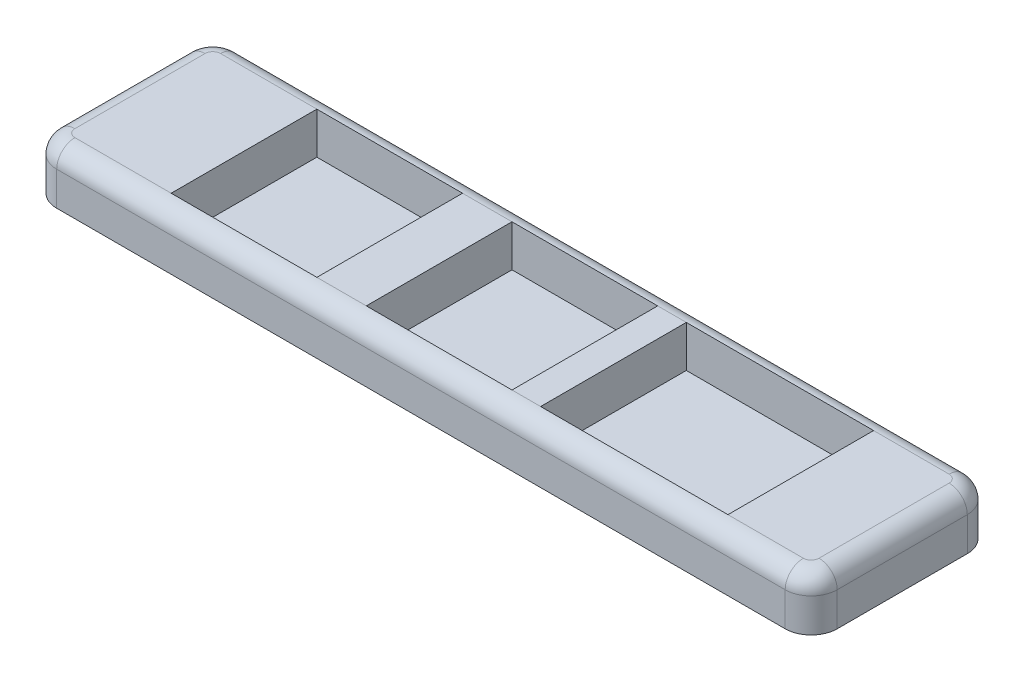
ISO-10303-21;
HEADER;
FILE_DESCRIPTION(('STEP AP214'),'2;1');
FILE_NAME('part.step','',(''),(''),'','','');
FILE_SCHEMA(('AUTOMOTIVE_DESIGN { 1 0 10303 214 1 1 1 1 }'));
ENDSEC;
DATA;
#1=APPLICATION_CONTEXT('core data for automotive mechanical design processes');
#2=APPLICATION_PROTOCOL_DEFINITION('international standard','automotive_design',2000,#1);
#3=PRODUCT_CONTEXT('',#1,'mechanical');
#4=PRODUCT('Part','Part','',(#3));
#5=PRODUCT_RELATED_PRODUCT_CATEGORY('part','',(#4));
#6=PRODUCT_DEFINITION_FORMATION('','',#4);
#7=PRODUCT_DEFINITION_CONTEXT('part definition',#1,'design');
#8=PRODUCT_DEFINITION('design','',#6,#7);
#9=PRODUCT_DEFINITION_SHAPE('','',#8);
#10=(LENGTH_UNIT() NAMED_UNIT(*) SI_UNIT(.MILLI.,.METRE.));
#11=(NAMED_UNIT(*) PLANE_ANGLE_UNIT() SI_UNIT($,.RADIAN.));
#12=(NAMED_UNIT(*) SI_UNIT($,.STERADIAN.) SOLID_ANGLE_UNIT());
#13=UNCERTAINTY_MEASURE_WITH_UNIT(LENGTH_MEASURE(1.E-05),#10,'distance_accuracy_value','');
#14=(GEOMETRIC_REPRESENTATION_CONTEXT(3) GLOBAL_UNCERTAINTY_ASSIGNED_CONTEXT((#13)) GLOBAL_UNIT_ASSIGNED_CONTEXT((#10,
#11,#12)) REPRESENTATION_CONTEXT('',''));
#15=CARTESIAN_POINT('',(0.,0.,0.));
#16=DIRECTION('',(0.,0.,1.));
#17=DIRECTION('',(1.,0.,0.));
#18=AXIS2_PLACEMENT_3D('',#15,#16,#17);
#19=CARTESIAN_POINT('',(0.,10.,0.));
#20=DIRECTION('',(0.,-1.,0.));
#21=DIRECTION('',(0.,0.,-1.));
#22=AXIS2_PLACEMENT_3D('',#19,#20,#21);
#23=PLANE('',#22);
#24=CARTESIAN_POINT('',(-70.,10.,-12.5));
#25=DIRECTION('',(0.,-1.,0.));
#26=DIRECTION('',(0.,0.,-1.));
#27=AXIS2_PLACEMENT_3D('',#24,#25,#26);
#28=CIRCLE('',#27,1.5);
#29=CARTESIAN_POINT('',(-71.5,10.,-12.5));
#30=VERTEX_POINT('',#29);
#31=CARTESIAN_POINT('',(-70.,10.,-14.));
#32=VERTEX_POINT('',#31);
#33=EDGE_CURVE('E347',#30,#32,#28,.T.);
#34=ORIENTED_EDGE('',*,*,#33,.F.);
#35=DIRECTION('',(0.,0.,1.));
#36=VECTOR('',#35,1.);
#37=CARTESIAN_POINT('',(-71.5,10.,0.));
#38=LINE('',#37,#36);
#39=CARTESIAN_POINT('',(-71.5,10.,12.5));
#40=VERTEX_POINT('',#39);
#41=EDGE_CURVE('E308',#30,#40,#38,.T.);
#42=ORIENTED_EDGE('',*,*,#41,.T.);
#43=CARTESIAN_POINT('',(-70.,10.,12.5));
#44=DIRECTION('',(0.,-1.,0.));
#45=DIRECTION('',(0.,0.,-1.));
#46=AXIS2_PLACEMENT_3D('',#43,#44,#45);
#47=CIRCLE('',#46,1.5);
#48=CARTESIAN_POINT('',(-70.,10.,14.));
#49=VERTEX_POINT('',#48);
#50=EDGE_CURVE('E344',#49,#40,#47,.T.);
#51=ORIENTED_EDGE('',*,*,#50,.F.);
#52=DIRECTION('',(1.,0.,0.));
#53=VECTOR('',#52,1.);
#54=CARTESIAN_POINT('',(0.,10.,14.));
#55=LINE('',#54,#53);
#56=CARTESIAN_POINT('',(-51.5,10.,14.));
#57=VERTEX_POINT('',#56);
#58=EDGE_CURVE('E306',#49,#57,#55,.T.);
#59=ORIENTED_EDGE('',*,*,#58,.T.);
#60=DIRECTION('',(0.,0.,1.));
#61=VECTOR('',#60,1.);
#62=CARTESIAN_POINT('',(-51.5,10.,14.));
#63=LINE('',#62,#61);
#64=CARTESIAN_POINT('',(-51.5,10.,-14.));
#65=VERTEX_POINT('',#64);
#66=EDGE_CURVE('E244',#65,#57,#63,.T.);
#67=ORIENTED_EDGE('',*,*,#66,.F.);
#68=DIRECTION('',(-1.,0.,0.));
#69=VECTOR('',#68,1.);
#70=CARTESIAN_POINT('',(0.,10.,-14.));
#71=LINE('',#70,#69);
#72=EDGE_CURVE('E311',#65,#32,#71,.T.);
#73=ORIENTED_EDGE('',*,*,#72,.T.);
#74=EDGE_LOOP('',(#34,#42,#51,#59,#67,#73));
#75=FACE_BOUND('',#74,.T.);
#76=ADVANCED_FACE('F39',(#75),#23,.F.);
#77=CARTESIAN_POINT('',(70.,10.,-12.5));
#78=DIRECTION('',(0.,-1.,0.));
#79=DIRECTION('',(0.,0.,-1.));
#80=AXIS2_PLACEMENT_3D('',#77,#78,#79);
#81=CIRCLE('',#80,1.5);
#82=CARTESIAN_POINT('',(70.,10.,-14.));
#83=VERTEX_POINT('',#82);
#84=CARTESIAN_POINT('',(71.5,10.,-12.5));
#85=VERTEX_POINT('',#84);
#86=EDGE_CURVE('E337',#83,#85,#81,.T.);
#87=ORIENTED_EDGE('',*,*,#86,.F.);
#88=DIRECTION('',(-1.,0.,0.));
#89=VECTOR('',#88,1.);
#90=CARTESIAN_POINT('',(0.,10.,-14.));
#91=LINE('',#90,#89);
#92=CARTESIAN_POINT('',(55.5,10.,-14.));
#93=VERTEX_POINT('',#92);
#94=EDGE_CURVE('E300',#83,#93,#91,.T.);
#95=ORIENTED_EDGE('',*,*,#94,.T.);
#96=DIRECTION('',(0.,0.,-1.));
#97=VECTOR('',#96,1.);
#98=CARTESIAN_POINT('',(55.5,10.,14.));
#99=LINE('',#98,#97);
#100=CARTESIAN_POINT('',(55.5,10.,14.));
#101=VERTEX_POINT('',#100);
#102=EDGE_CURVE('E415',#101,#93,#99,.T.);
#103=ORIENTED_EDGE('',*,*,#102,.F.);
#104=DIRECTION('',(1.,0.,0.));
#105=VECTOR('',#104,1.);
#106=CARTESIAN_POINT('',(0.,10.,14.));
#107=LINE('',#106,#105);
#108=CARTESIAN_POINT('',(70.,10.,14.));
#109=VERTEX_POINT('',#108);
#110=EDGE_CURVE('E294',#101,#109,#107,.T.);
#111=ORIENTED_EDGE('',*,*,#110,.T.);
#112=CARTESIAN_POINT('',(70.,10.,12.5));
#113=DIRECTION('',(0.,-1.,0.));
#114=DIRECTION('',(0.,0.,-1.));
#115=AXIS2_PLACEMENT_3D('',#112,#113,#114);
#116=CIRCLE('',#115,1.5);
#117=CARTESIAN_POINT('',(71.5,10.,12.5));
#118=VERTEX_POINT('',#117);
#119=EDGE_CURVE('E334',#118,#109,#116,.T.);
#120=ORIENTED_EDGE('',*,*,#119,.F.);
#121=DIRECTION('',(0.,0.,-1.));
#122=VECTOR('',#121,1.);
#123=CARTESIAN_POINT('',(71.5,10.,0.));
#124=LINE('',#123,#122);
#125=EDGE_CURVE('E297',#118,#85,#124,.T.);
#126=ORIENTED_EDGE('',*,*,#125,.T.);
#127=EDGE_LOOP('',(#87,#95,#103,#111,#120,#126));
#128=FACE_BOUND('',#127,.T.);
#129=ADVANCED_FACE('F412',(#128),#23,.F.);
#130=DIRECTION('',(0.,0.,1.));
#131=VECTOR('',#130,1.);
#132=CARTESIAN_POINT('',(19.5,10.,14.));
#133=LINE('',#132,#131);
#134=CARTESIAN_POINT('',(19.5,10.,-14.));
#135=VERTEX_POINT('',#134);
#136=CARTESIAN_POINT('',(19.5,10.,14.));
#137=VERTEX_POINT('',#136);
#138=EDGE_CURVE('E232',#135,#137,#133,.T.);
#139=ORIENTED_EDGE('',*,*,#138,.F.);
#140=DIRECTION('',(-1.,0.,0.));
#141=VECTOR('',#140,1.);
#142=CARTESIAN_POINT('',(0.,10.,-14.));
#143=LINE('',#142,#141);
#144=CARTESIAN_POINT('',(14.,10.,-14.));
#145=VERTEX_POINT('',#144);
#146=EDGE_CURVE('E316',#135,#145,#143,.T.);
#147=ORIENTED_EDGE('',*,*,#146,.T.);
#148=DIRECTION('',(0.,0.,-1.));
#149=VECTOR('',#148,1.);
#150=CARTESIAN_POINT('',(14.,10.,14.));
#151=LINE('',#150,#149);
#152=CARTESIAN_POINT('',(14.,10.,14.));
#153=VERTEX_POINT('',#152);
#154=EDGE_CURVE('E261',#153,#145,#151,.T.);
#155=ORIENTED_EDGE('',*,*,#154,.F.);
#156=DIRECTION('',(1.,0.,0.));
#157=VECTOR('',#156,1.);
#158=CARTESIAN_POINT('',(0.,10.,14.));
#159=LINE('',#158,#157);
#160=EDGE_CURVE('E302',#153,#137,#159,.T.);
#161=ORIENTED_EDGE('',*,*,#160,.T.);
#162=EDGE_LOOP('',(#139,#147,#155,#161));
#163=FACE_BOUND('',#162,.T.);
#164=ADVANCED_FACE('F496',(#163),#23,.F.);
#165=DIRECTION('',(0.,0.,1.));
#166=VECTOR('',#165,1.);
#167=CARTESIAN_POINT('',(-14.,10.,14.));
#168=LINE('',#167,#166);
#169=CARTESIAN_POINT('',(-14.,10.,-14.));
#170=VERTEX_POINT('',#169);
#171=CARTESIAN_POINT('',(-14.,10.,14.));
#172=VERTEX_POINT('',#171);
#173=EDGE_CURVE('E266',#170,#172,#168,.T.);
#174=ORIENTED_EDGE('',*,*,#173,.F.);
#175=DIRECTION('',(-1.,0.,0.));
#176=VECTOR('',#175,1.);
#177=CARTESIAN_POINT('',(0.,10.,-14.));
#178=LINE('',#177,#176);
#179=CARTESIAN_POINT('',(-23.5,10.,-14.));
#180=VERTEX_POINT('',#179);
#181=EDGE_CURVE('E314',#170,#180,#178,.T.);
#182=ORIENTED_EDGE('',*,*,#181,.T.);
#183=DIRECTION('',(0.,0.,-1.));
#184=VECTOR('',#183,1.);
#185=CARTESIAN_POINT('',(-23.5,10.,14.));
#186=LINE('',#185,#184);
#187=CARTESIAN_POINT('',(-23.5,10.,14.));
#188=VERTEX_POINT('',#187);
#189=EDGE_CURVE('E239',#188,#180,#186,.T.);
#190=ORIENTED_EDGE('',*,*,#189,.F.);
#191=DIRECTION('',(1.,0.,0.));
#192=VECTOR('',#191,1.);
#193=CARTESIAN_POINT('',(0.,10.,14.));
#194=LINE('',#193,#192);
#195=EDGE_CURVE('E304',#188,#172,#194,.T.);
#196=ORIENTED_EDGE('',*,*,#195,.T.);
#197=EDGE_LOOP('',(#174,#182,#190,#196));
#198=FACE_BOUND('',#197,.T.);
#199=ADVANCED_FACE('F469',(#198),#23,.F.);
#200=CARTESIAN_POINT('',(55.5,10.,14.));
#201=DIRECTION('',(-1.,0.,0.));
#202=DIRECTION('',(0.,0.,1.));
#203=AXIS2_PLACEMENT_3D('',#200,#201,#202);
#204=PLANE('',#203);
#205=DIRECTION('',(0.,-1.,0.));
#206=VECTOR('',#205,1.);
#207=CARTESIAN_POINT('',(55.5,10.,-14.));
#208=LINE('',#207,#206);
#209=CARTESIAN_POINT('',(55.5,2.,-14.));
#210=VERTEX_POINT('',#209);
#211=EDGE_CURVE('E222',#93,#210,#208,.T.);
#212=ORIENTED_EDGE('',*,*,#211,.T.);
#213=DIRECTION('',(0.,0.,1.));
#214=VECTOR('',#213,1.);
#215=CARTESIAN_POINT('',(55.5,2.,14.));
#216=LINE('',#215,#214);
#217=CARTESIAN_POINT('',(55.5,2.,14.));
#218=VERTEX_POINT('',#217);
#219=EDGE_CURVE('E204',#210,#218,#216,.T.);
#220=ORIENTED_EDGE('',*,*,#219,.T.);
#221=DIRECTION('',(0.,-1.,0.));
#222=VECTOR('',#221,1.);
#223=CARTESIAN_POINT('',(55.5,10.,14.));
#224=LINE('',#223,#222);
#225=EDGE_CURVE('E219',#101,#218,#224,.T.);
#226=ORIENTED_EDGE('',*,*,#225,.F.);
#227=ORIENTED_EDGE('',*,*,#102,.T.);
#228=EDGE_LOOP('',(#212,#220,#226,#227));
#229=FACE_BOUND('',#228,.T.);
#230=ADVANCED_FACE('F217',(#229),#204,.T.);
#231=CARTESIAN_POINT('',(19.5,10.,-14.));
#232=DIRECTION('',(0.,0.,1.));
#233=DIRECTION('',(1.,0.,0.));
#234=AXIS2_PLACEMENT_3D('',#231,#232,#233);
#235=PLANE('',#234);
#236=DIRECTION('',(0.,-1.,0.));
#237=VECTOR('',#236,1.);
#238=CARTESIAN_POINT('',(19.5,10.,-14.));
#239=LINE('',#238,#237);
#240=CARTESIAN_POINT('',(19.5,2.,-14.));
#241=VERTEX_POINT('',#240);
#242=EDGE_CURVE('E230',#135,#241,#239,.T.);
#243=ORIENTED_EDGE('',*,*,#242,.T.);
#244=DIRECTION('',(1.,0.,0.));
#245=VECTOR('',#244,1.);
#246=CARTESIAN_POINT('',(19.5,2.,-14.));
#247=LINE('',#246,#245);
#248=EDGE_CURVE('E223',#241,#210,#247,.T.);
#249=ORIENTED_EDGE('',*,*,#248,.T.);
#250=ORIENTED_EDGE('',*,*,#211,.F.);
#251=DIRECTION('',(-1.,0.,0.));
#252=VECTOR('',#251,1.);
#253=CARTESIAN_POINT('',(19.5,10.,-14.));
#254=LINE('',#253,#252);
#255=EDGE_CURVE('E489',#93,#135,#254,.T.);
#256=ORIENTED_EDGE('',*,*,#255,.T.);
#257=EDGE_LOOP('',(#243,#249,#250,#256));
#258=FACE_BOUND('',#257,.T.);
#259=ADVANCED_FACE('F501',(#258),#235,.T.);
#260=CARTESIAN_POINT('',(19.5,10.,14.));
#261=DIRECTION('',(1.,0.,0.));
#262=DIRECTION('',(0.,0.,-1.));
#263=AXIS2_PLACEMENT_3D('',#260,#261,#262);
#264=PLANE('',#263);
#265=DIRECTION('',(0.,-1.,0.));
#266=VECTOR('',#265,1.);
#267=CARTESIAN_POINT('',(19.5,10.,14.));
#268=LINE('',#267,#266);
#269=CARTESIAN_POINT('',(19.5,2.,14.));
#270=VERTEX_POINT('',#269);
#271=EDGE_CURVE('E228',#137,#270,#268,.T.);
#272=ORIENTED_EDGE('',*,*,#271,.T.);
#273=DIRECTION('',(0.,0.,-1.));
#274=VECTOR('',#273,1.);
#275=CARTESIAN_POINT('',(19.5,2.,14.));
#276=LINE('',#275,#274);
#277=EDGE_CURVE('E207',#270,#241,#276,.T.);
#278=ORIENTED_EDGE('',*,*,#277,.T.);
#279=ORIENTED_EDGE('',*,*,#242,.F.);
#280=ORIENTED_EDGE('',*,*,#138,.T.);
#281=EDGE_LOOP('',(#272,#278,#279,#280));
#282=FACE_BOUND('',#281,.T.);
#283=ADVANCED_FACE('F494',(#282),#264,.T.);
#284=CARTESIAN_POINT('',(19.5,10.,14.));
#285=DIRECTION('',(0.,0.,-1.));
#286=DIRECTION('',(-1.,0.,0.));
#287=AXIS2_PLACEMENT_3D('',#284,#285,#286);
#288=PLANE('',#287);
#289=ORIENTED_EDGE('',*,*,#225,.T.);
#290=DIRECTION('',(-1.,0.,0.));
#291=VECTOR('',#290,1.);
#292=CARTESIAN_POINT('',(19.5,2.,14.));
#293=LINE('',#292,#291);
#294=EDGE_CURVE('E201',#218,#270,#293,.T.);
#295=ORIENTED_EDGE('',*,*,#294,.T.);
#296=ORIENTED_EDGE('',*,*,#271,.F.);
#297=DIRECTION('',(1.,0.,0.));
#298=VECTOR('',#297,1.);
#299=CARTESIAN_POINT('',(19.5,10.,14.));
#300=LINE('',#299,#298);
#301=EDGE_CURVE('E227',#137,#101,#300,.T.);
#302=ORIENTED_EDGE('',*,*,#301,.T.);
#303=EDGE_LOOP('',(#289,#295,#296,#302));
#304=FACE_BOUND('',#303,.T.);
#305=ADVANCED_FACE('F225',(#304),#288,.T.);
#306=CARTESIAN_POINT('',(14.,10.,14.));
#307=DIRECTION('',(-1.,0.,0.));
#308=DIRECTION('',(0.,0.,1.));
#309=AXIS2_PLACEMENT_3D('',#306,#307,#308);
#310=PLANE('',#309);
#311=DIRECTION('',(0.,-1.,0.));
#312=VECTOR('',#311,1.);
#313=CARTESIAN_POINT('',(14.,10.,-14.));
#314=LINE('',#313,#312);
#315=CARTESIAN_POINT('',(14.,2.,-14.));
#316=VERTEX_POINT('',#315);
#317=EDGE_CURVE('E280',#145,#316,#314,.T.);
#318=ORIENTED_EDGE('',*,*,#317,.T.);
#319=DIRECTION('',(0.,0.,1.));
#320=VECTOR('',#319,1.);
#321=CARTESIAN_POINT('',(14.,2.,14.));
#322=LINE('',#321,#320);
#323=CARTESIAN_POINT('',(14.,2.,14.));
#324=VERTEX_POINT('',#323);
#325=EDGE_CURVE('E508',#316,#324,#322,.T.);
#326=ORIENTED_EDGE('',*,*,#325,.T.);
#327=DIRECTION('',(0.,-1.,0.));
#328=VECTOR('',#327,1.);
#329=CARTESIAN_POINT('',(14.,10.,14.));
#330=LINE('',#329,#328);
#331=EDGE_CURVE('E271',#153,#324,#330,.T.);
#332=ORIENTED_EDGE('',*,*,#331,.F.);
#333=ORIENTED_EDGE('',*,*,#154,.T.);
#334=EDGE_LOOP('',(#318,#326,#332,#333));
#335=FACE_BOUND('',#334,.T.);
#336=ADVANCED_FACE('F522',(#335),#310,.T.);
#337=CARTESIAN_POINT('',(-14.,10.,-14.));
#338=DIRECTION('',(0.,0.,1.));
#339=DIRECTION('',(1.,0.,0.));
#340=AXIS2_PLACEMENT_3D('',#337,#338,#339);
#341=PLANE('',#340);
#342=DIRECTION('',(0.,-1.,0.));
#343=VECTOR('',#342,1.);
#344=CARTESIAN_POINT('',(-14.,10.,-14.));
#345=LINE('',#344,#343);
#346=CARTESIAN_POINT('',(-14.,2.,-14.));
#347=VERTEX_POINT('',#346);
#348=EDGE_CURVE('E277',#170,#347,#345,.T.);
#349=ORIENTED_EDGE('',*,*,#348,.T.);
#350=DIRECTION('',(1.,0.,0.));
#351=VECTOR('',#350,1.);
#352=CARTESIAN_POINT('',(-14.,2.,-14.));
#353=LINE('',#352,#351);
#354=EDGE_CURVE('E511',#347,#316,#353,.T.);
#355=ORIENTED_EDGE('',*,*,#354,.T.);
#356=ORIENTED_EDGE('',*,*,#317,.F.);
#357=DIRECTION('',(-1.,0.,0.));
#358=VECTOR('',#357,1.);
#359=CARTESIAN_POINT('',(-14.,10.,-14.));
#360=LINE('',#359,#358);
#361=EDGE_CURVE('E264',#145,#170,#360,.T.);
#362=ORIENTED_EDGE('',*,*,#361,.T.);
#363=EDGE_LOOP('',(#349,#355,#356,#362));
#364=FACE_BOUND('',#363,.T.);
#365=ADVANCED_FACE('F519',(#364),#341,.T.);
#366=CARTESIAN_POINT('',(-14.,10.,14.));
#367=DIRECTION('',(1.,0.,0.));
#368=DIRECTION('',(0.,0.,-1.));
#369=AXIS2_PLACEMENT_3D('',#366,#367,#368);
#370=PLANE('',#369);
#371=DIRECTION('',(0.,-1.,0.));
#372=VECTOR('',#371,1.);
#373=CARTESIAN_POINT('',(-14.,10.,14.));
#374=LINE('',#373,#372);
#375=CARTESIAN_POINT('',(-14.,2.,14.));
#376=VERTEX_POINT('',#375);
#377=EDGE_CURVE('E274',#172,#376,#374,.T.);
#378=ORIENTED_EDGE('',*,*,#377,.T.);
#379=DIRECTION('',(0.,0.,-1.));
#380=VECTOR('',#379,1.);
#381=CARTESIAN_POINT('',(-14.,2.,14.));
#382=LINE('',#381,#380);
#383=EDGE_CURVE('E483',#376,#347,#382,.T.);
#384=ORIENTED_EDGE('',*,*,#383,.T.);
#385=ORIENTED_EDGE('',*,*,#348,.F.);
#386=ORIENTED_EDGE('',*,*,#173,.T.);
#387=EDGE_LOOP('',(#378,#384,#385,#386));
#388=FACE_BOUND('',#387,.T.);
#389=ADVANCED_FACE('F516',(#388),#370,.T.);
#390=CARTESIAN_POINT('',(-14.,10.,14.));
#391=DIRECTION('',(0.,0.,-1.));
#392=DIRECTION('',(-1.,0.,0.));
#393=AXIS2_PLACEMENT_3D('',#390,#391,#392);
#394=PLANE('',#393);
#395=ORIENTED_EDGE('',*,*,#331,.T.);
#396=DIRECTION('',(-1.,0.,0.));
#397=VECTOR('',#396,1.);
#398=CARTESIAN_POINT('',(-14.,2.,14.));
#399=LINE('',#398,#397);
#400=EDGE_CURVE('E503',#324,#376,#399,.T.);
#401=ORIENTED_EDGE('',*,*,#400,.T.);
#402=ORIENTED_EDGE('',*,*,#377,.F.);
#403=DIRECTION('',(1.,0.,0.));
#404=VECTOR('',#403,1.);
#405=CARTESIAN_POINT('',(-14.,10.,14.));
#406=LINE('',#405,#404);
#407=EDGE_CURVE('E269',#172,#153,#406,.T.);
#408=ORIENTED_EDGE('',*,*,#407,.T.);
#409=EDGE_LOOP('',(#395,#401,#402,#408));
#410=FACE_BOUND('',#409,.T.);
#411=ADVANCED_FACE('F525',(#410),#394,.T.);
#412=CARTESIAN_POINT('',(-23.5,10.,14.));
#413=DIRECTION('',(-1.,0.,0.));
#414=DIRECTION('',(0.,0.,1.));
#415=AXIS2_PLACEMENT_3D('',#412,#413,#414);
#416=PLANE('',#415);
#417=DIRECTION('',(0.,-1.,0.));
#418=VECTOR('',#417,1.);
#419=CARTESIAN_POINT('',(-23.5,10.,-14.));
#420=LINE('',#419,#418);
#421=CARTESIAN_POINT('',(-23.5,2.,-14.));
#422=VERTEX_POINT('',#421);
#423=EDGE_CURVE('E258',#180,#422,#420,.T.);
#424=ORIENTED_EDGE('',*,*,#423,.T.);
#425=DIRECTION('',(0.,0.,1.));
#426=VECTOR('',#425,1.);
#427=CARTESIAN_POINT('',(-23.5,2.,14.));
#428=LINE('',#427,#426);
#429=CARTESIAN_POINT('',(-23.5,2.,14.));
#430=VERTEX_POINT('',#429);
#431=EDGE_CURVE('E466',#422,#430,#428,.T.);
#432=ORIENTED_EDGE('',*,*,#431,.T.);
#433=DIRECTION('',(0.,-1.,0.));
#434=VECTOR('',#433,1.);
#435=CARTESIAN_POINT('',(-23.5,10.,14.));
#436=LINE('',#435,#434);
#437=EDGE_CURVE('E249',#188,#430,#436,.T.);
#438=ORIENTED_EDGE('',*,*,#437,.F.);
#439=ORIENTED_EDGE('',*,*,#189,.T.);
#440=EDGE_LOOP('',(#424,#432,#438,#439));
#441=FACE_BOUND('',#440,.T.);
#442=ADVANCED_FACE('F464',(#441),#416,.T.);
#443=CARTESIAN_POINT('',(-51.5,10.,-14.));
#444=DIRECTION('',(0.,0.,1.));
#445=DIRECTION('',(1.,0.,0.));
#446=AXIS2_PLACEMENT_3D('',#443,#444,#445);
#447=PLANE('',#446);
#448=DIRECTION('',(0.,-1.,0.));
#449=VECTOR('',#448,1.);
#450=CARTESIAN_POINT('',(-51.5,10.,-14.));
#451=LINE('',#450,#449);
#452=CARTESIAN_POINT('',(-51.5,2.,-14.));
#453=VERTEX_POINT('',#452);
#454=EDGE_CURVE('E255',#65,#453,#451,.T.);
#455=ORIENTED_EDGE('',*,*,#454,.T.);
#456=DIRECTION('',(1.,0.,0.));
#457=VECTOR('',#456,1.);
#458=CARTESIAN_POINT('',(-51.5,2.,-14.));
#459=LINE('',#458,#457);
#460=EDGE_CURVE('E477',#453,#422,#459,.T.);
#461=ORIENTED_EDGE('',*,*,#460,.T.);
#462=ORIENTED_EDGE('',*,*,#423,.F.);
#463=DIRECTION('',(-1.,0.,0.));
#464=VECTOR('',#463,1.);
#465=CARTESIAN_POINT('',(-51.5,10.,-14.));
#466=LINE('',#465,#464);
#467=EDGE_CURVE('E242',#180,#65,#466,.T.);
#468=ORIENTED_EDGE('',*,*,#467,.T.);
#469=EDGE_LOOP('',(#455,#461,#462,#468));
#470=FACE_BOUND('',#469,.T.);
#471=ADVANCED_FACE('F475',(#470),#447,.T.);
#472=CARTESIAN_POINT('',(-51.5,10.,14.));
#473=DIRECTION('',(1.,0.,0.));
#474=DIRECTION('',(0.,0.,-1.));
#475=AXIS2_PLACEMENT_3D('',#472,#473,#474);
#476=PLANE('',#475);
#477=DIRECTION('',(0.,-1.,0.));
#478=VECTOR('',#477,1.);
#479=CARTESIAN_POINT('',(-51.5,10.,14.));
#480=LINE('',#479,#478);
#481=CARTESIAN_POINT('',(-51.5,2.,14.));
#482=VERTEX_POINT('',#481);
#483=EDGE_CURVE('E252',#57,#482,#480,.T.);
#484=ORIENTED_EDGE('',*,*,#483,.T.);
#485=DIRECTION('',(0.,0.,-1.));
#486=VECTOR('',#485,1.);
#487=CARTESIAN_POINT('',(-51.5,2.,14.));
#488=LINE('',#487,#486);
#489=EDGE_CURVE('E479',#482,#453,#488,.T.);
#490=ORIENTED_EDGE('',*,*,#489,.T.);
#491=ORIENTED_EDGE('',*,*,#454,.F.);
#492=ORIENTED_EDGE('',*,*,#66,.T.);
#493=EDGE_LOOP('',(#484,#490,#491,#492));
#494=FACE_BOUND('',#493,.T.);
#495=ADVANCED_FACE('F453',(#494),#476,.T.);
#496=CARTESIAN_POINT('',(-51.5,10.,14.));
#497=DIRECTION('',(0.,0.,-1.));
#498=DIRECTION('',(-1.,0.,0.));
#499=AXIS2_PLACEMENT_3D('',#496,#497,#498);
#500=PLANE('',#499);
#501=ORIENTED_EDGE('',*,*,#437,.T.);
#502=DIRECTION('',(-1.,0.,0.));
#503=VECTOR('',#502,1.);
#504=CARTESIAN_POINT('',(-51.5,2.,14.));
#505=LINE('',#504,#503);
#506=EDGE_CURVE('E481',#430,#482,#505,.T.);
#507=ORIENTED_EDGE('',*,*,#506,.T.);
#508=ORIENTED_EDGE('',*,*,#483,.F.);
#509=DIRECTION('',(1.,0.,0.));
#510=VECTOR('',#509,1.);
#511=CARTESIAN_POINT('',(-51.5,10.,14.));
#512=LINE('',#511,#510);
#513=EDGE_CURVE('E247',#57,#188,#512,.T.);
#514=ORIENTED_EDGE('',*,*,#513,.T.);
#515=EDGE_LOOP('',(#501,#507,#508,#514));
#516=FACE_BOUND('',#515,.T.);
#517=ADVANCED_FACE('F459',(#516),#500,.T.);
#518=CARTESIAN_POINT('',(0.,0.,0.));
#519=DIRECTION('',(0.,-1.,0.));
#520=DIRECTION('',(0.,0.,-1.));
#521=AXIS2_PLACEMENT_3D('',#518,#519,#520);
#522=PLANE('',#521);
#523=DIRECTION('',(0.,0.,-1.));
#524=VECTOR('',#523,1.);
#525=CARTESIAN_POINT('',(75.,0.,17.5));
#526=LINE('',#525,#524);
#527=CARTESIAN_POINT('',(75.,0.,12.5));
#528=VERTEX_POINT('',#527);
#529=CARTESIAN_POINT('',(75.,0.,-12.5));
#530=VERTEX_POINT('',#529);
#531=EDGE_CURVE('E283',#528,#530,#526,.T.);
#532=ORIENTED_EDGE('',*,*,#531,.F.);
#533=CARTESIAN_POINT('',(70.,0.,12.5));
#534=DIRECTION('',(0.,-1.,0.));
#535=DIRECTION('',(0.,0.,-1.));
#536=AXIS2_PLACEMENT_3D('',#533,#534,#535);
#537=CIRCLE('',#536,5.);
#538=CARTESIAN_POINT('',(70.,0.,17.5));
#539=VERTEX_POINT('',#538);
#540=EDGE_CURVE('E366',#528,#539,#537,.T.);
#541=ORIENTED_EDGE('',*,*,#540,.T.);
#542=DIRECTION('',(1.,0.,0.));
#543=VECTOR('',#542,1.);
#544=CARTESIAN_POINT('',(-75.,0.,17.5));
#545=LINE('',#544,#543);
#546=CARTESIAN_POINT('',(-70.,0.,17.5));
#547=VERTEX_POINT('',#546);
#548=EDGE_CURVE('E291',#547,#539,#545,.T.);
#549=ORIENTED_EDGE('',*,*,#548,.F.);
#550=CARTESIAN_POINT('',(-70.,0.,12.5));
#551=DIRECTION('',(0.,-1.,0.));
#552=DIRECTION('',(0.,0.,-1.));
#553=AXIS2_PLACEMENT_3D('',#550,#551,#552);
#554=CIRCLE('',#553,5.);
#555=CARTESIAN_POINT('',(-75.,0.,12.5));
#556=VERTEX_POINT('',#555);
#557=EDGE_CURVE('E364',#547,#556,#554,.T.);
#558=ORIENTED_EDGE('',*,*,#557,.T.);
#559=DIRECTION('',(0.,0.,1.));
#560=VECTOR('',#559,1.);
#561=CARTESIAN_POINT('',(-75.,0.,17.5));
#562=LINE('',#561,#560);
#563=CARTESIAN_POINT('',(-75.,0.,-12.5));
#564=VERTEX_POINT('',#563);
#565=EDGE_CURVE('E288',#564,#556,#562,.T.);
#566=ORIENTED_EDGE('',*,*,#565,.F.);
#567=CARTESIAN_POINT('',(-70.,0.,-12.5));
#568=DIRECTION('',(0.,-1.,0.));
#569=DIRECTION('',(0.,0.,-1.));
#570=AXIS2_PLACEMENT_3D('',#567,#568,#569);
#571=CIRCLE('',#570,5.);
#572=CARTESIAN_POINT('',(-70.,0.,-17.5));
#573=VERTEX_POINT('',#572);
#574=EDGE_CURVE('E56',#564,#573,#571,.T.);
#575=ORIENTED_EDGE('',*,*,#574,.T.);
#576=DIRECTION('',(-1.,0.,0.));
#577=VECTOR('',#576,1.);
#578=CARTESIAN_POINT('',(-75.,0.,-17.5));
#579=LINE('',#578,#577);
#580=CARTESIAN_POINT('',(70.,0.,-17.5));
#581=VERTEX_POINT('',#580);
#582=EDGE_CURVE('E286',#581,#573,#579,.T.);
#583=ORIENTED_EDGE('',*,*,#582,.F.);
#584=CARTESIAN_POINT('',(70.,0.,-12.5));
#585=DIRECTION('',(0.,-1.,0.));
#586=DIRECTION('',(0.,0.,-1.));
#587=AXIS2_PLACEMENT_3D('',#584,#585,#586);
#588=CIRCLE('',#587,5.);
#589=EDGE_CURVE('E361',#581,#530,#588,.T.);
#590=ORIENTED_EDGE('',*,*,#589,.T.);
#591=EDGE_LOOP('',(#532,#541,#549,#558,#566,#575,#583,#590));
#592=FACE_BOUND('',#591,.T.);
#593=ADVANCED_FACE('F401',(#592),#522,.T.);
#594=CARTESIAN_POINT('',(75.,10.,17.5));
#595=DIRECTION('',(-1.,0.,0.));
#596=DIRECTION('',(0.,0.,1.));
#597=AXIS2_PLACEMENT_3D('',#594,#595,#596);
#598=PLANE('',#597);
#599=DIRECTION('',(0.,0.,-1.));
#600=VECTOR('',#599,1.);
#601=CARTESIAN_POINT('',(75.,6.5,17.5));
#602=LINE('',#601,#600);
#603=CARTESIAN_POINT('',(75.,6.5,-12.5));
#604=VERTEX_POINT('',#603);
#605=CARTESIAN_POINT('',(75.,6.5,12.5));
#606=VERTEX_POINT('',#605);
#607=EDGE_CURVE('E323',#604,#606,#602,.F.);
#608=ORIENTED_EDGE('',*,*,#607,.T.);
#609=DIRECTION('',(0.,-1.,0.));
#610=VECTOR('',#609,1.);
#611=CARTESIAN_POINT('',(75.,10.,12.5));
#612=LINE('',#611,#610);
#613=EDGE_CURVE('E359',#606,#528,#612,.T.);
#614=ORIENTED_EDGE('',*,*,#613,.T.);
#615=ORIENTED_EDGE('',*,*,#531,.T.);
#616=DIRECTION('',(0.,-1.,0.));
#617=VECTOR('',#616,1.);
#618=CARTESIAN_POINT('',(75.,10.,-12.5));
#619=LINE('',#618,#617);
#620=EDGE_CURVE('E357',#530,#604,#619,.F.);
#621=ORIENTED_EDGE('',*,*,#620,.T.);
#622=EDGE_LOOP('',(#608,#614,#615,#621));
#623=FACE_BOUND('',#622,.T.);
#624=ADVANCED_FACE('F398',(#623),#598,.F.);
#625=CARTESIAN_POINT('',(-75.,10.,-17.5));
#626=DIRECTION('',(0.,0.,1.));
#627=DIRECTION('',(1.,0.,0.));
#628=AXIS2_PLACEMENT_3D('',#625,#626,#627);
#629=PLANE('',#628);
#630=ORIENTED_EDGE('',*,*,#582,.T.);
#631=DIRECTION('',(0.,-1.,0.));
#632=VECTOR('',#631,1.);
#633=CARTESIAN_POINT('',(-70.,10.,-17.5));
#634=LINE('',#633,#632);
#635=CARTESIAN_POINT('',(-70.,6.5,-17.5));
#636=VERTEX_POINT('',#635);
#637=EDGE_CURVE('E11',#573,#636,#634,.F.);
#638=ORIENTED_EDGE('',*,*,#637,.T.);
#639=DIRECTION('',(-1.,0.,0.));
#640=VECTOR('',#639,1.);
#641=CARTESIAN_POINT('',(-75.,6.5,-17.5));
#642=LINE('',#641,#640);
#643=CARTESIAN_POINT('',(70.,6.5,-17.5));
#644=VERTEX_POINT('',#643);
#645=EDGE_CURVE('E321',#636,#644,#642,.F.);
#646=ORIENTED_EDGE('',*,*,#645,.T.);
#647=DIRECTION('',(0.,-1.,0.));
#648=VECTOR('',#647,1.);
#649=CARTESIAN_POINT('',(70.,10.,-17.5));
#650=LINE('',#649,#648);
#651=EDGE_CURVE('E48',#644,#581,#650,.T.);
#652=ORIENTED_EDGE('',*,*,#651,.T.);
#653=EDGE_LOOP('',(#630,#638,#646,#652));
#654=FACE_BOUND('',#653,.T.);
#655=ADVANCED_FACE('F673',(#654),#629,.F.);
#656=CARTESIAN_POINT('',(-75.,10.,17.5));
#657=DIRECTION('',(1.,0.,0.));
#658=DIRECTION('',(0.,0.,-1.));
#659=AXIS2_PLACEMENT_3D('',#656,#657,#658);
#660=PLANE('',#659);
#661=ORIENTED_EDGE('',*,*,#565,.T.);
#662=DIRECTION('',(0.,-1.,0.));
#663=VECTOR('',#662,1.);
#664=CARTESIAN_POINT('',(-75.,10.,12.5));
#665=LINE('',#664,#663);
#666=CARTESIAN_POINT('',(-75.,6.5,12.5));
#667=VERTEX_POINT('',#666);
#668=EDGE_CURVE('E374',#556,#667,#665,.F.);
#669=ORIENTED_EDGE('',*,*,#668,.T.);
#670=DIRECTION('',(0.,0.,1.));
#671=VECTOR('',#670,1.);
#672=CARTESIAN_POINT('',(-75.,6.5,17.5));
#673=LINE('',#672,#671);
#674=CARTESIAN_POINT('',(-75.,6.5,-12.5));
#675=VERTEX_POINT('',#674);
#676=EDGE_CURVE('E318',#667,#675,#673,.F.);
#677=ORIENTED_EDGE('',*,*,#676,.T.);
#678=DIRECTION('',(0.,-1.,0.));
#679=VECTOR('',#678,1.);
#680=CARTESIAN_POINT('',(-75.,10.,-12.5));
#681=LINE('',#680,#679);
#682=EDGE_CURVE('E372',#675,#564,#681,.T.);
#683=ORIENTED_EDGE('',*,*,#682,.T.);
#684=EDGE_LOOP('',(#661,#669,#677,#683));
#685=FACE_BOUND('',#684,.T.);
#686=ADVANCED_FACE('F429',(#685),#660,.F.);
#687=CARTESIAN_POINT('',(-75.,10.,17.5));
#688=DIRECTION('',(0.,0.,-1.));
#689=DIRECTION('',(-1.,0.,0.));
#690=AXIS2_PLACEMENT_3D('',#687,#688,#689);
#691=PLANE('',#690);
#692=ORIENTED_EDGE('',*,*,#548,.T.);
#693=DIRECTION('',(0.,-1.,0.));
#694=VECTOR('',#693,1.);
#695=CARTESIAN_POINT('',(70.,10.,17.5));
#696=LINE('',#695,#694);
#697=CARTESIAN_POINT('',(70.,6.5,17.5));
#698=VERTEX_POINT('',#697);
#699=EDGE_CURVE('E370',#539,#698,#696,.F.);
#700=ORIENTED_EDGE('',*,*,#699,.T.);
#701=DIRECTION('',(1.,0.,0.));
#702=VECTOR('',#701,1.);
#703=CARTESIAN_POINT('',(-75.,6.5,17.5));
#704=LINE('',#703,#702);
#705=CARTESIAN_POINT('',(-70.,6.5,17.5));
#706=VERTEX_POINT('',#705);
#707=EDGE_CURVE('E326',#698,#706,#704,.F.);
#708=ORIENTED_EDGE('',*,*,#707,.T.);
#709=DIRECTION('',(0.,-1.,0.));
#710=VECTOR('',#709,1.);
#711=CARTESIAN_POINT('',(-70.,10.,17.5));
#712=LINE('',#711,#710);
#713=EDGE_CURVE('E368',#706,#547,#712,.T.);
#714=ORIENTED_EDGE('',*,*,#713,.T.);
#715=EDGE_LOOP('',(#692,#700,#708,#714));
#716=FACE_BOUND('',#715,.T.);
#717=ADVANCED_FACE('F423',(#716),#691,.F.);
#718=CARTESIAN_POINT('',(0.,2.,0.));
#719=DIRECTION('',(0.,-1.,0.));
#720=DIRECTION('',(0.,0.,-1.));
#721=AXIS2_PLACEMENT_3D('',#718,#719,#720);
#722=PLANE('',#721);
#723=ORIENTED_EDGE('',*,*,#489,.F.);
#724=ORIENTED_EDGE('',*,*,#506,.F.);
#725=ORIENTED_EDGE('',*,*,#431,.F.);
#726=ORIENTED_EDGE('',*,*,#460,.F.);
#727=EDGE_LOOP('',(#723,#724,#725,#726));
#728=FACE_BOUND('',#727,.T.);
#729=ADVANCED_FACE('F528',(#728),#722,.F.);
#730=CARTESIAN_POINT('',(0.,2.,0.));
#731=DIRECTION('',(0.,-1.,0.));
#732=DIRECTION('',(0.,0.,-1.));
#733=AXIS2_PLACEMENT_3D('',#730,#731,#732);
#734=PLANE('',#733);
#735=ORIENTED_EDGE('',*,*,#383,.F.);
#736=ORIENTED_EDGE('',*,*,#400,.F.);
#737=ORIENTED_EDGE('',*,*,#325,.F.);
#738=ORIENTED_EDGE('',*,*,#354,.F.);
#739=EDGE_LOOP('',(#735,#736,#737,#738));
#740=FACE_BOUND('',#739,.T.);
#741=ADVANCED_FACE('F526',(#740),#734,.F.);
#742=CARTESIAN_POINT('',(0.,2.,0.));
#743=DIRECTION('',(0.,-1.,0.));
#744=DIRECTION('',(0.,0.,-1.));
#745=AXIS2_PLACEMENT_3D('',#742,#743,#744);
#746=PLANE('',#745);
#747=ORIENTED_EDGE('',*,*,#277,.F.);
#748=ORIENTED_EDGE('',*,*,#294,.F.);
#749=ORIENTED_EDGE('',*,*,#219,.F.);
#750=ORIENTED_EDGE('',*,*,#248,.F.);
#751=EDGE_LOOP('',(#747,#748,#749,#750));
#752=FACE_BOUND('',#751,.T.);
#753=ADVANCED_FACE('F203',(#752),#746,.F.);
#754=CARTESIAN_POINT('',(71.5,6.5,0.));
#755=DIRECTION('',(0.,0.,-1.));
#756=DIRECTION('',(-1.,0.,0.));
#757=AXIS2_PLACEMENT_3D('',#754,#755,#756);
#758=CYLINDRICAL_SURFACE('',#757,3.5);
#759=ORIENTED_EDGE('',*,*,#607,.F.);
#760=CARTESIAN_POINT('',(71.5,6.5,-12.5));
#761=DIRECTION('',(0.,0.,1.));
#762=DIRECTION('',(1.,0.,0.));
#763=AXIS2_PLACEMENT_3D('',#760,#761,#762);
#764=CIRCLE('',#763,3.5);
#765=EDGE_CURVE('E331',#604,#85,#764,.T.);
#766=ORIENTED_EDGE('',*,*,#765,.T.);
#767=ORIENTED_EDGE('',*,*,#125,.F.);
#768=CARTESIAN_POINT('',(71.5,6.5,12.5));
#769=DIRECTION('',(0.,0.,-1.));
#770=DIRECTION('',(-1.,0.,0.));
#771=AXIS2_PLACEMENT_3D('',#768,#769,#770);
#772=CIRCLE('',#771,3.5);
#773=EDGE_CURVE('E329',#118,#606,#772,.T.);
#774=ORIENTED_EDGE('',*,*,#773,.T.);
#775=EDGE_LOOP('',(#759,#766,#767,#774));
#776=FACE_BOUND('',#775,.T.);
#777=ADVANCED_FACE('F409',(#776),#758,.T.);
#778=CARTESIAN_POINT('',(0.,6.5,-14.));
#779=DIRECTION('',(-1.,0.,0.));
#780=DIRECTION('',(0.,0.,1.));
#781=AXIS2_PLACEMENT_3D('',#778,#779,#780);
#782=CYLINDRICAL_SURFACE('',#781,3.5);
#783=ORIENTED_EDGE('',*,*,#645,.F.);
#784=CARTESIAN_POINT('',(-70.,6.5,-14.));
#785=DIRECTION('',(1.,0.,0.));
#786=DIRECTION('',(0.,0.,-1.));
#787=AXIS2_PLACEMENT_3D('',#784,#785,#786);
#788=CIRCLE('',#787,3.5);
#789=EDGE_CURVE('E341',#636,#32,#788,.T.);
#790=ORIENTED_EDGE('',*,*,#789,.T.);
#791=ORIENTED_EDGE('',*,*,#72,.F.);
#792=ORIENTED_EDGE('',*,*,#467,.F.);
#793=ORIENTED_EDGE('',*,*,#181,.F.);
#794=ORIENTED_EDGE('',*,*,#361,.F.);
#795=ORIENTED_EDGE('',*,*,#146,.F.);
#796=ORIENTED_EDGE('',*,*,#255,.F.);
#797=ORIENTED_EDGE('',*,*,#94,.F.);
#798=CARTESIAN_POINT('',(70.,6.5,-14.));
#799=DIRECTION('',(-1.,0.,0.));
#800=DIRECTION('',(0.,0.,1.));
#801=AXIS2_PLACEMENT_3D('',#798,#799,#800);
#802=CIRCLE('',#801,3.5);
#803=EDGE_CURVE('E339',#83,#644,#802,.T.);
#804=ORIENTED_EDGE('',*,*,#803,.T.);
#805=EDGE_LOOP('',(#783,#790,#791,#792,#793,#794,#795,#796,#797,#804));
#806=FACE_BOUND('',#805,.T.);
#807=ADVANCED_FACE('F443',(#806),#782,.T.);
#808=CARTESIAN_POINT('',(0.,6.5,14.));
#809=DIRECTION('',(1.,0.,0.));
#810=DIRECTION('',(0.,0.,-1.));
#811=AXIS2_PLACEMENT_3D('',#808,#809,#810);
#812=CYLINDRICAL_SURFACE('',#811,3.5);
#813=ORIENTED_EDGE('',*,*,#707,.F.);
#814=CARTESIAN_POINT('',(70.,6.5,14.));
#815=DIRECTION('',(-1.,0.,0.));
#816=DIRECTION('',(0.,0.,1.));
#817=AXIS2_PLACEMENT_3D('',#814,#815,#816);
#818=CIRCLE('',#817,3.5);
#819=EDGE_CURVE('E355',#698,#109,#818,.T.);
#820=ORIENTED_EDGE('',*,*,#819,.T.);
#821=ORIENTED_EDGE('',*,*,#110,.F.);
#822=ORIENTED_EDGE('',*,*,#301,.F.);
#823=ORIENTED_EDGE('',*,*,#160,.F.);
#824=ORIENTED_EDGE('',*,*,#407,.F.);
#825=ORIENTED_EDGE('',*,*,#195,.F.);
#826=ORIENTED_EDGE('',*,*,#513,.F.);
#827=ORIENTED_EDGE('',*,*,#58,.F.);
#828=CARTESIAN_POINT('',(-70.,6.5,14.));
#829=DIRECTION('',(1.,0.,0.));
#830=DIRECTION('',(0.,0.,-1.));
#831=AXIS2_PLACEMENT_3D('',#828,#829,#830);
#832=CIRCLE('',#831,3.5);
#833=EDGE_CURVE('E353',#49,#706,#832,.T.);
#834=ORIENTED_EDGE('',*,*,#833,.T.);
#835=EDGE_LOOP('',(#813,#820,#821,#822,#823,#824,#825,#826,#827,#834));
#836=FACE_BOUND('',#835,.T.);
#837=ADVANCED_FACE('F418',(#836),#812,.T.);
#838=CARTESIAN_POINT('',(-71.5,6.5,0.));
#839=DIRECTION('',(0.,0.,1.));
#840=DIRECTION('',(1.,0.,0.));
#841=AXIS2_PLACEMENT_3D('',#838,#839,#840);
#842=CYLINDRICAL_SURFACE('',#841,3.5);
#843=ORIENTED_EDGE('',*,*,#676,.F.);
#844=CARTESIAN_POINT('',(-71.5,6.5,12.5));
#845=DIRECTION('',(0.,0.,-1.));
#846=DIRECTION('',(-1.,0.,0.));
#847=AXIS2_PLACEMENT_3D('',#844,#845,#846);
#848=CIRCLE('',#847,3.5);
#849=EDGE_CURVE('E351',#667,#40,#848,.T.);
#850=ORIENTED_EDGE('',*,*,#849,.T.);
#851=ORIENTED_EDGE('',*,*,#41,.F.);
#852=CARTESIAN_POINT('',(-71.5,6.5,-12.5));
#853=DIRECTION('',(0.,0.,1.));
#854=DIRECTION('',(1.,0.,0.));
#855=AXIS2_PLACEMENT_3D('',#852,#853,#854);
#856=CIRCLE('',#855,3.5);
#857=EDGE_CURVE('E349',#30,#675,#856,.T.);
#858=ORIENTED_EDGE('',*,*,#857,.T.);
#859=EDGE_LOOP('',(#843,#850,#851,#858));
#860=FACE_BOUND('',#859,.T.);
#861=ADVANCED_FACE('F738',(#860),#842,.T.);
#862=CARTESIAN_POINT('',(70.,10.,-12.5));
#863=DIRECTION('',(0.,-1.,0.));
#864=DIRECTION('',(0.,0.,-1.));
#865=AXIS2_PLACEMENT_3D('',#862,#863,#864);
#866=CYLINDRICAL_SURFACE('',#865,5.);
#867=ORIENTED_EDGE('',*,*,#589,.F.);
#868=ORIENTED_EDGE('',*,*,#651,.F.);
#869=CARTESIAN_POINT('',(70.,6.5,-12.5));
#870=DIRECTION('',(0.,-1.,0.));
#871=DIRECTION('',(0.,0.,-1.));
#872=AXIS2_PLACEMENT_3D('',#869,#870,#871);
#873=CIRCLE('',#872,5.);
#874=EDGE_CURVE('E212',#604,#644,#873,.F.);
#875=ORIENTED_EDGE('',*,*,#874,.F.);
#876=ORIENTED_EDGE('',*,*,#620,.F.);
#877=EDGE_LOOP('',(#867,#868,#875,#876));
#878=FACE_BOUND('',#877,.T.);
#879=ADVANCED_FACE('F405',(#878),#866,.T.);
#880=CARTESIAN_POINT('',(70.,6.5,-12.5));
#881=DIRECTION('',(0.,-1.,0.));
#882=DIRECTION('',(0.,0.,-1.));
#883=AXIS2_PLACEMENT_3D('',#880,#881,#882);
#884=DEGENERATE_TOROIDAL_SURFACE('',#883,1.5,3.5,.T.);
#885=ORIENTED_EDGE('',*,*,#765,.F.);
#886=ORIENTED_EDGE('',*,*,#874,.T.);
#887=ORIENTED_EDGE('',*,*,#803,.F.);
#888=ORIENTED_EDGE('',*,*,#86,.T.);
#889=EDGE_LOOP('',(#885,#886,#887,#888));
#890=FACE_BOUND('',#889,.T.);
#891=ADVANCED_FACE('F754',(#890),#884,.T.);
#892=CARTESIAN_POINT('',(-70.,10.,-12.5));
#893=DIRECTION('',(0.,-1.,0.));
#894=DIRECTION('',(0.,0.,-1.));
#895=AXIS2_PLACEMENT_3D('',#892,#893,#894);
#896=CYLINDRICAL_SURFACE('',#895,5.);
#897=ORIENTED_EDGE('',*,*,#574,.F.);
#898=ORIENTED_EDGE('',*,*,#682,.F.);
#899=CARTESIAN_POINT('',(-70.,6.5,-12.5));
#900=DIRECTION('',(0.,-1.,0.));
#901=DIRECTION('',(0.,0.,-1.));
#902=AXIS2_PLACEMENT_3D('',#899,#900,#901);
#903=CIRCLE('',#902,5.);
#904=EDGE_CURVE('E379',#636,#675,#903,.F.);
#905=ORIENTED_EDGE('',*,*,#904,.F.);
#906=ORIENTED_EDGE('',*,*,#637,.F.);
#907=EDGE_LOOP('',(#897,#898,#905,#906));
#908=FACE_BOUND('',#907,.T.);
#909=ADVANCED_FACE('F434',(#908),#896,.T.);
#910=CARTESIAN_POINT('',(-70.,6.5,-12.5));
#911=DIRECTION('',(0.,-1.,0.));
#912=DIRECTION('',(0.,0.,-1.));
#913=AXIS2_PLACEMENT_3D('',#910,#911,#912);
#914=DEGENERATE_TOROIDAL_SURFACE('',#913,1.5,3.5,.T.);
#915=ORIENTED_EDGE('',*,*,#789,.F.);
#916=ORIENTED_EDGE('',*,*,#904,.T.);
#917=ORIENTED_EDGE('',*,*,#857,.F.);
#918=ORIENTED_EDGE('',*,*,#33,.T.);
#919=EDGE_LOOP('',(#915,#916,#917,#918));
#920=FACE_BOUND('',#919,.T.);
#921=ADVANCED_FACE('F439',(#920),#914,.T.);
#922=CARTESIAN_POINT('',(-70.,10.,12.5));
#923=DIRECTION('',(0.,-1.,0.));
#924=DIRECTION('',(0.,0.,-1.));
#925=AXIS2_PLACEMENT_3D('',#922,#923,#924);
#926=CYLINDRICAL_SURFACE('',#925,5.);
#927=ORIENTED_EDGE('',*,*,#557,.F.);
#928=ORIENTED_EDGE('',*,*,#713,.F.);
#929=CARTESIAN_POINT('',(-70.,6.5,12.5));
#930=DIRECTION('',(0.,-1.,0.));
#931=DIRECTION('',(0.,0.,-1.));
#932=AXIS2_PLACEMENT_3D('',#929,#930,#931);
#933=CIRCLE('',#932,5.);
#934=EDGE_CURVE('E381',#667,#706,#933,.F.);
#935=ORIENTED_EDGE('',*,*,#934,.F.);
#936=ORIENTED_EDGE('',*,*,#668,.F.);
#937=EDGE_LOOP('',(#927,#928,#935,#936));
#938=FACE_BOUND('',#937,.T.);
#939=ADVANCED_FACE('F426',(#938),#926,.T.);
#940=CARTESIAN_POINT('',(-70.,6.5,12.5));
#941=DIRECTION('',(0.,-1.,0.));
#942=DIRECTION('',(0.,0.,-1.));
#943=AXIS2_PLACEMENT_3D('',#940,#941,#942);
#944=DEGENERATE_TOROIDAL_SURFACE('',#943,1.5,3.5,.T.);
#945=ORIENTED_EDGE('',*,*,#833,.F.);
#946=ORIENTED_EDGE('',*,*,#50,.T.);
#947=ORIENTED_EDGE('',*,*,#849,.F.);
#948=ORIENTED_EDGE('',*,*,#934,.T.);
#949=EDGE_LOOP('',(#945,#946,#947,#948));
#950=FACE_BOUND('',#949,.T.);
#951=ADVANCED_FACE('F793',(#950),#944,.T.);
#952=CARTESIAN_POINT('',(70.,10.,12.5));
#953=DIRECTION('',(0.,-1.,0.));
#954=DIRECTION('',(0.,0.,-1.));
#955=AXIS2_PLACEMENT_3D('',#952,#953,#954);
#956=CYLINDRICAL_SURFACE('',#955,5.);
#957=ORIENTED_EDGE('',*,*,#540,.F.);
#958=ORIENTED_EDGE('',*,*,#613,.F.);
#959=CARTESIAN_POINT('',(70.,6.5,12.5));
#960=DIRECTION('',(0.,-1.,0.));
#961=DIRECTION('',(0.,0.,-1.));
#962=AXIS2_PLACEMENT_3D('',#959,#960,#961);
#963=CIRCLE('',#962,5.);
#964=EDGE_CURVE('E43',#698,#606,#963,.F.);
#965=ORIENTED_EDGE('',*,*,#964,.F.);
#966=ORIENTED_EDGE('',*,*,#699,.F.);
#967=EDGE_LOOP('',(#957,#958,#965,#966));
#968=FACE_BOUND('',#967,.T.);
#969=ADVANCED_FACE('F41',(#968),#956,.T.);
#970=CARTESIAN_POINT('',(70.,6.5,12.5));
#971=DIRECTION('',(0.,-1.,0.));
#972=DIRECTION('',(0.,0.,-1.));
#973=AXIS2_PLACEMENT_3D('',#970,#971,#972);
#974=DEGENERATE_TOROIDAL_SURFACE('',#973,1.5,3.5,.T.);
#975=ORIENTED_EDGE('',*,*,#773,.F.);
#976=ORIENTED_EDGE('',*,*,#119,.T.);
#977=ORIENTED_EDGE('',*,*,#819,.F.);
#978=ORIENTED_EDGE('',*,*,#964,.T.);
#979=EDGE_LOOP('',(#975,#976,#977,#978));
#980=FACE_BOUND('',#979,.T.);
#981=ADVANCED_FACE('F390',(#980),#974,.T.);
#982=CLOSED_SHELL('',(#76,#129,#164,#199,#230,#259,#283,#305,#336,#365,#389,#411,#442,#471,#495,
#517,#593,#624,#655,#686,#717,#729,#741,#753,#777,#807,#837,#861,#879,#891,#909,#921,#939,#951,
#969,#981));
#983=MANIFOLD_SOLID_BREP('B2',#982);
#984=ADVANCED_BREP_SHAPE_REPRESENTATION('',(#18,#983),#14);
#985=SHAPE_DEFINITION_REPRESENTATION(#9,#984);
ENDSEC;
END-ISO-10303-21;
